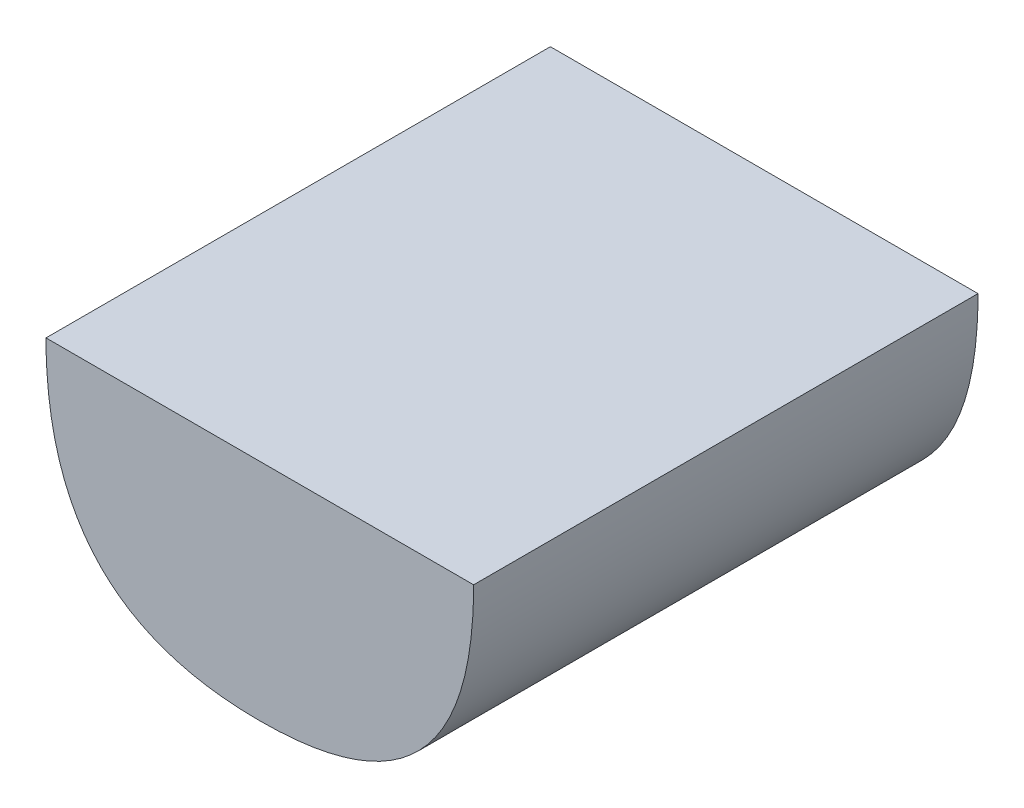
ISO-10303-21;
HEADER;
FILE_DESCRIPTION(('STEP AP214'),'2;1');
FILE_NAME('part.step','',(''),(''),'','','');
FILE_SCHEMA(('AUTOMOTIVE_DESIGN { 1 0 10303 214 1 1 1 1 }'));
ENDSEC;
DATA;
#1=APPLICATION_CONTEXT('core data for automotive mechanical design processes');
#2=APPLICATION_PROTOCOL_DEFINITION('international standard','automotive_design',2000,#1);
#3=PRODUCT_CONTEXT('',#1,'mechanical');
#4=PRODUCT('Part','Part','',(#3));
#5=PRODUCT_RELATED_PRODUCT_CATEGORY('part','',(#4));
#6=PRODUCT_DEFINITION_FORMATION('','',#4);
#7=PRODUCT_DEFINITION_CONTEXT('part definition',#1,'design');
#8=PRODUCT_DEFINITION('design','',#6,#7);
#9=PRODUCT_DEFINITION_SHAPE('','',#8);
#10=(LENGTH_UNIT() NAMED_UNIT(*) SI_UNIT(.MILLI.,.METRE.));
#11=(NAMED_UNIT(*) PLANE_ANGLE_UNIT() SI_UNIT($,.RADIAN.));
#12=(NAMED_UNIT(*) SI_UNIT($,.STERADIAN.) SOLID_ANGLE_UNIT());
#13=UNCERTAINTY_MEASURE_WITH_UNIT(LENGTH_MEASURE(1.E-05),#10,'distance_accuracy_value','');
#14=(GEOMETRIC_REPRESENTATION_CONTEXT(3) GLOBAL_UNCERTAINTY_ASSIGNED_CONTEXT((#13)) GLOBAL_UNIT_ASSIGNED_CONTEXT((#10,
#11,#12)) REPRESENTATION_CONTEXT('',''));
#15=CARTESIAN_POINT('',(0.,0.,0.));
#16=DIRECTION('',(0.,0.,1.));
#17=DIRECTION('',(1.,0.,0.));
#18=AXIS2_PLACEMENT_3D('',#15,#16,#17);
#19=CARTESIAN_POINT('',(0.,0.,356.616));
#20=CARTESIAN_POINT('',(-302.357037840975,-0.0664450020700911,356.616));
#21=CARTESIAN_POINT('',(-302.357037840975,317.813001305344,356.616));
#22=(BOUNDED_CURVE() B_SPLINE_CURVE(2,(#19,#20,#21),.UNSPECIFIED.,.F.,
.F.) B_SPLINE_CURVE_WITH_KNOTS((3,3),(0.,1.),
.UNSPECIFIED.) CURVE() GEOMETRIC_REPRESENTATION_ITEM() RATIONAL_B_SPLINE_CURVE((1.,
1.01936959538977,1.)) REPRESENTATION_ITEM(''));
#23=DIRECTION('',(0.,0.,-1.));
#24=VECTOR('',#23,1.);
#25=SURFACE_OF_LINEAR_EXTRUSION('',#22,#24);
#26=CARTESIAN_POINT('',(0.,0.,304.8));
#27=CARTESIAN_POINT('',(-302.357037840975,-0.0664450020700911,304.8));
#28=CARTESIAN_POINT('',(-302.357037840975,317.813001305344,304.8));
#29=(BOUNDED_CURVE() B_SPLINE_CURVE(2,(#26,#27,#28),.UNSPECIFIED.,.F.,
.F.) B_SPLINE_CURVE_WITH_KNOTS((3,3),(0.,1.),
.UNSPECIFIED.) CURVE() GEOMETRIC_REPRESENTATION_ITEM() RATIONAL_B_SPLINE_CURVE((1.,
1.01936959538977,1.)) REPRESENTATION_ITEM(''));
#30=CARTESIAN_POINT('',(-0.262571485168617,0.,304.8));
#31=VERTEX_POINT('',#30);
#32=CARTESIAN_POINT('',(-208.490476277115,60.9599999999999,304.8));
#33=VERTEX_POINT('',#32);
#34=EDGE_CURVE('E98',#31,#33,#29,.T.);
#35=ORIENTED_EDGE('',*,*,#34,.F.);
#36=CARTESIAN_POINT('',(0.,0.,304.8));
#37=CARTESIAN_POINT('',(-0.131315330519347,-2.8857431169774E-05,304.8));
#38=CARTESIAN_POINT('',(-0.262571485168617,0.,304.8));
#39=(BOUNDED_CURVE() B_SPLINE_CURVE(2,(#36,#37,#38),.UNSPECIFIED.,.F.,
.F.) B_SPLINE_CURVE_WITH_KNOTS((3,3),(0.,0.000426056560842924),
.UNSPECIFIED.) CURVE() GEOMETRIC_REPRESENTATION_ITEM() RATIONAL_B_SPLINE_CURVE((1.,
1.0000082525432,1.00001649805429)) REPRESENTATION_ITEM(''));
#40=CARTESIAN_POINT('',(0.,0.,304.8));
#41=VERTEX_POINT('',#40);
#42=EDGE_CURVE('E123',#31,#41,#39,.F.);
#43=ORIENTED_EDGE('',*,*,#42,.T.);
#44=DIRECTION('',(0.,0.,-1.));
#45=VECTOR('',#44,1.);
#46=CARTESIAN_POINT('',(0.,0.,356.616));
#47=LINE('',#46,#45);
#48=CARTESIAN_POINT('',(0.,0.,356.616));
#49=VERTEX_POINT('',#48);
#50=EDGE_CURVE('E119',#49,#41,#47,.T.);
#51=ORIENTED_EDGE('',*,*,#50,.F.);
#52=CARTESIAN_POINT('',(-302.357037840975,317.813001305344,356.616));
#53=VERTEX_POINT('',#52);
#54=EDGE_CURVE('E122',#49,#53,#22,.T.);
#55=ORIENTED_EDGE('',*,*,#54,.T.);
#56=DIRECTION('',(0.,0.,-1.));
#57=VECTOR('',#56,1.);
#58=CARTESIAN_POINT('',(-302.357037840975,317.813001305344,356.616));
#59=LINE('',#58,#57);
#60=CARTESIAN_POINT('',(-302.357037840975,317.813001305344,-356.616));
#61=VERTEX_POINT('',#60);
#62=EDGE_CURVE('E140',#53,#61,#59,.T.);
#63=ORIENTED_EDGE('',*,*,#62,.T.);
#64=CARTESIAN_POINT('',(0.,0.,-356.616));
#65=CARTESIAN_POINT('',(-302.357037840975,-0.0664450020700911,-356.616));
#66=CARTESIAN_POINT('',(-302.357037840975,317.813001305344,-356.616));
#67=(BOUNDED_CURVE() B_SPLINE_CURVE(2,(#64,#65,#66),.UNSPECIFIED.,.F.,
.F.) B_SPLINE_CURVE_WITH_KNOTS((3,3),(0.,1.),
.UNSPECIFIED.) CURVE() GEOMETRIC_REPRESENTATION_ITEM() RATIONAL_B_SPLINE_CURVE((1.,
1.01936959538977,1.)) REPRESENTATION_ITEM(''));
#68=CARTESIAN_POINT('',(0.,0.,-356.616));
#69=VERTEX_POINT('',#68);
#70=EDGE_CURVE('E136',#69,#61,#67,.T.);
#71=ORIENTED_EDGE('',*,*,#70,.F.);
#72=CARTESIAN_POINT('',(0.,0.,-304.8));
#73=VERTEX_POINT('',#72);
#74=EDGE_CURVE('E127',#73,#69,#47,.T.);
#75=ORIENTED_EDGE('',*,*,#74,.F.);
#76=CARTESIAN_POINT('',(0.,0.,-304.8));
#77=CARTESIAN_POINT('',(-0.131315330519347,-2.8857431169774E-05,-304.8));
#78=CARTESIAN_POINT('',(-0.262571485168617,0.,-304.8));
#79=(BOUNDED_CURVE() B_SPLINE_CURVE(2,(#76,#77,#78),.UNSPECIFIED.,.F.,
.F.) B_SPLINE_CURVE_WITH_KNOTS((3,3),(0.,0.000426056560842924),
.UNSPECIFIED.) CURVE() GEOMETRIC_REPRESENTATION_ITEM() RATIONAL_B_SPLINE_CURVE((1.,
1.0000082525432,1.00001649805429)) REPRESENTATION_ITEM(''));
#80=CARTESIAN_POINT('',(-0.262571485168617,0.,-304.8));
#81=VERTEX_POINT('',#80);
#82=EDGE_CURVE('E233',#81,#73,#79,.F.);
#83=ORIENTED_EDGE('',*,*,#82,.F.);
#84=CARTESIAN_POINT('',(0.,0.,-304.8));
#85=CARTESIAN_POINT('',(-302.357037840975,-0.0664450020700911,-304.8));
#86=CARTESIAN_POINT('',(-302.357037840975,317.813001305344,-304.8));
#87=(BOUNDED_CURVE() B_SPLINE_CURVE(2,(#84,#85,#86),.UNSPECIFIED.,.F.,
.F.) B_SPLINE_CURVE_WITH_KNOTS((3,3),(0.,1.),
.UNSPECIFIED.) CURVE() GEOMETRIC_REPRESENTATION_ITEM() RATIONAL_B_SPLINE_CURVE((1.,
1.01936959538977,1.)) REPRESENTATION_ITEM(''));
#88=CARTESIAN_POINT('',(-208.490476277115,60.9599999999999,-304.8));
#89=VERTEX_POINT('',#88);
#90=EDGE_CURVE('E144',#81,#89,#87,.T.);
#91=ORIENTED_EDGE('',*,*,#90,.T.);
#92=DIRECTION('',(0.,0.,-1.));
#93=VECTOR('',#92,1.);
#94=CARTESIAN_POINT('',(-208.490476277116,60.9599999999979,356.616));
#95=LINE('',#94,#93);
#96=EDGE_CURVE('E65',#89,#33,#95,.F.);
#97=ORIENTED_EDGE('',*,*,#96,.T.);
#98=EDGE_LOOP('',(#35,#43,#51,#55,#63,#71,#75,#83,#91,#97));
#99=FACE_BOUND('',#98,.T.);
#100=ADVANCED_FACE('F43',(#99),#25,.T.);
#101=CARTESIAN_POINT('',(0.,0.,356.616));
#102=CARTESIAN_POINT('',(302.357037840975,-0.0664450020701375,356.616));
#103=CARTESIAN_POINT('',(302.357037840975,317.813001305344,356.616));
#104=(BOUNDED_CURVE() B_SPLINE_CURVE(2,(#101,#102,#103),.UNSPECIFIED.,.F.,
.F.) B_SPLINE_CURVE_WITH_KNOTS((3,3),(0.,1.),
.UNSPECIFIED.) CURVE() GEOMETRIC_REPRESENTATION_ITEM() RATIONAL_B_SPLINE_CURVE((1.,
1.01936959538977,1.)) REPRESENTATION_ITEM(''));
#105=DIRECTION('',(0.,0.,-1.));
#106=VECTOR('',#105,1.);
#107=SURFACE_OF_LINEAR_EXTRUSION('',#104,#106);
#108=ORIENTED_EDGE('',*,*,#50,.T.);
#109=CARTESIAN_POINT('',(0.,0.,304.8));
#110=CARTESIAN_POINT('',(0.131315330519791,-2.88574311698918E-05,304.8));
#111=CARTESIAN_POINT('',(0.262571485169505,0.,304.8));
#112=(BOUNDED_CURVE() B_SPLINE_CURVE(2,(#109,#110,#111),.UNSPECIFIED.,.F.,
.F.) B_SPLINE_CURVE_WITH_KNOTS((3,3),(0.,0.000426056560844365),
.UNSPECIFIED.) CURVE() GEOMETRIC_REPRESENTATION_ITEM() RATIONAL_B_SPLINE_CURVE((1.,
1.0000082525432,1.00001649805429)) REPRESENTATION_ITEM(''));
#113=CARTESIAN_POINT('',(0.262571485169286,0.,304.8));
#114=VERTEX_POINT('',#113);
#115=EDGE_CURVE('E48',#41,#114,#112,.T.);
#116=ORIENTED_EDGE('',*,*,#115,.T.);
#117=CARTESIAN_POINT('',(0.,0.,304.8));
#118=CARTESIAN_POINT('',(302.357037840975,-0.0664450020701375,304.8));
#119=CARTESIAN_POINT('',(302.357037840975,317.813001305344,304.8));
#120=(BOUNDED_CURVE() B_SPLINE_CURVE(2,(#117,#118,#119),.UNSPECIFIED.,.F.,
.F.) B_SPLINE_CURVE_WITH_KNOTS((3,3),(0.,1.),
.UNSPECIFIED.) CURVE() GEOMETRIC_REPRESENTATION_ITEM() RATIONAL_B_SPLINE_CURVE((1.,
1.01936959538977,1.)) REPRESENTATION_ITEM(''));
#121=CARTESIAN_POINT('',(208.490476277116,60.9599999999999,304.8));
#122=VERTEX_POINT('',#121);
#123=EDGE_CURVE('E94',#114,#122,#120,.T.);
#124=ORIENTED_EDGE('',*,*,#123,.T.);
#125=DIRECTION('',(0.,0.,-1.));
#126=VECTOR('',#125,1.);
#127=CARTESIAN_POINT('',(208.490476277116,60.9599999999979,356.616));
#128=LINE('',#127,#126);
#129=CARTESIAN_POINT('',(208.490476277116,60.9599999999999,-304.8));
#130=VERTEX_POINT('',#129);
#131=EDGE_CURVE('E57',#130,#122,#128,.F.);
#132=ORIENTED_EDGE('',*,*,#131,.F.);
#133=CARTESIAN_POINT('',(0.,0.,-304.8));
#134=CARTESIAN_POINT('',(302.357037840975,-0.0664450020701375,-304.8));
#135=CARTESIAN_POINT('',(302.357037840975,317.813001305344,-304.8));
#136=(BOUNDED_CURVE() B_SPLINE_CURVE(2,(#133,#134,#135),.UNSPECIFIED.,.F.,
.F.) B_SPLINE_CURVE_WITH_KNOTS((3,3),(0.,1.),
.UNSPECIFIED.) CURVE() GEOMETRIC_REPRESENTATION_ITEM() RATIONAL_B_SPLINE_CURVE((1.,
1.01936959538977,1.)) REPRESENTATION_ITEM(''));
#137=CARTESIAN_POINT('',(0.262571485169287,0.,-304.8));
#138=VERTEX_POINT('',#137);
#139=EDGE_CURVE('E214',#138,#130,#136,.T.);
#140=ORIENTED_EDGE('',*,*,#139,.F.);
#141=CARTESIAN_POINT('',(0.,0.,-304.8));
#142=CARTESIAN_POINT('',(0.131315330519682,-2.88574311698678E-05,-304.8));
#143=CARTESIAN_POINT('',(0.262571485169287,0.,-304.8));
#144=(BOUNDED_CURVE() B_SPLINE_CURVE(2,(#141,#142,#143),.UNSPECIFIED.,.F.,
.F.) B_SPLINE_CURVE_WITH_KNOTS((3,3),(0.,0.000426056560844011),
.UNSPECIFIED.) CURVE() GEOMETRIC_REPRESENTATION_ITEM() RATIONAL_B_SPLINE_CURVE((1.,
1.0000082525432,1.00001649805429)) REPRESENTATION_ITEM(''));
#145=EDGE_CURVE('E223',#73,#138,#144,.T.);
#146=ORIENTED_EDGE('',*,*,#145,.F.);
#147=ORIENTED_EDGE('',*,*,#74,.T.);
#148=CARTESIAN_POINT('',(0.,0.,-356.616));
#149=CARTESIAN_POINT('',(302.357037840975,-0.0664450020701375,-356.616));
#150=CARTESIAN_POINT('',(302.357037840975,317.813001305344,-356.616));
#151=(BOUNDED_CURVE() B_SPLINE_CURVE(2,(#148,#149,#150),.UNSPECIFIED.,.F.,
.F.) B_SPLINE_CURVE_WITH_KNOTS((3,3),(0.,1.),
.UNSPECIFIED.) CURVE() GEOMETRIC_REPRESENTATION_ITEM() RATIONAL_B_SPLINE_CURVE((1.,
1.01936959538977,1.)) REPRESENTATION_ITEM(''));
#152=CARTESIAN_POINT('',(302.357037840975,317.813001305344,-356.616));
#153=VERTEX_POINT('',#152);
#154=EDGE_CURVE('E185',#69,#153,#151,.T.);
#155=ORIENTED_EDGE('',*,*,#154,.T.);
#156=DIRECTION('',(0.,0.,-1.));
#157=VECTOR('',#156,1.);
#158=CARTESIAN_POINT('',(302.357037840975,317.813001305344,356.616));
#159=LINE('',#158,#157);
#160=CARTESIAN_POINT('',(302.357037840975,317.813001305344,356.616));
#161=VERTEX_POINT('',#160);
#162=EDGE_CURVE('E131',#161,#153,#159,.T.);
#163=ORIENTED_EDGE('',*,*,#162,.F.);
#164=EDGE_CURVE('E129',#49,#161,#104,.T.);
#165=ORIENTED_EDGE('',*,*,#164,.F.);
#166=EDGE_LOOP('',(#108,#116,#124,#132,#140,#146,#147,#155,#163,#165));
#167=FACE_BOUND('',#166,.T.);
#168=ADVANCED_FACE('F45',(#167),#107,.F.);
#169=CARTESIAN_POINT('',(-302.357037840975,317.813001305344,356.616));
#170=DIRECTION('',(0.,1.,0.));
#171=DIRECTION('',(-1.,0.,0.));
#172=AXIS2_PLACEMENT_3D('',#169,#170,#171);
#173=PLANE('',#172);
#174=ORIENTED_EDGE('',*,*,#162,.T.);
#175=DIRECTION('',(1.,0.,0.));
#176=VECTOR('',#175,1.);
#177=CARTESIAN_POINT('',(-302.357037840975,317.813001305344,-356.616));
#178=LINE('',#177,#176);
#179=EDGE_CURVE('E182',#61,#153,#178,.T.);
#180=ORIENTED_EDGE('',*,*,#179,.F.);
#181=ORIENTED_EDGE('',*,*,#62,.F.);
#182=DIRECTION('',(1.,0.,0.));
#183=VECTOR('',#182,1.);
#184=CARTESIAN_POINT('',(-302.357037840975,317.813001305344,356.616));
#185=LINE('',#184,#183);
#186=EDGE_CURVE('E137',#53,#161,#185,.T.);
#187=ORIENTED_EDGE('',*,*,#186,.T.);
#188=EDGE_LOOP('',(#174,#180,#181,#187));
#189=FACE_BOUND('',#188,.T.);
#190=ADVANCED_FACE('F174',(#189),#173,.T.);
#191=CARTESIAN_POINT('',(-227.492823154556,78.6576013625369,356.616));
#192=DIRECTION('',(0.,0.,1.));
#193=DIRECTION('',(1.,0.,0.));
#194=AXIS2_PLACEMENT_3D('',#191,#192,#193);
#195=PLANE('',#194);
#196=ORIENTED_EDGE('',*,*,#54,.F.);
#197=ORIENTED_EDGE('',*,*,#164,.T.);
#198=ORIENTED_EDGE('',*,*,#186,.F.);
#199=EDGE_LOOP('',(#196,#197,#198));
#200=FACE_BOUND('',#199,.T.);
#201=ADVANCED_FACE('F138',(#200),#195,.T.);
#202=CARTESIAN_POINT('',(-227.492823154556,78.6576013625369,-356.616));
#203=DIRECTION('',(0.,0.,1.));
#204=DIRECTION('',(1.,0.,0.));
#205=AXIS2_PLACEMENT_3D('',#202,#203,#204);
#206=PLANE('',#205);
#207=ORIENTED_EDGE('',*,*,#70,.T.);
#208=ORIENTED_EDGE('',*,*,#179,.T.);
#209=ORIENTED_EDGE('',*,*,#154,.F.);
#210=EDGE_LOOP('',(#207,#208,#209));
#211=FACE_BOUND('',#210,.T.);
#212=ADVANCED_FACE('F162',(#211),#206,.F.);
#213=CARTESIAN_POINT('',(0.,0.,304.8));
#214=DIRECTION('',(0.,0.,1.));
#215=DIRECTION('',(1.,0.,0.));
#216=AXIS2_PLACEMENT_3D('',#213,#214,#215);
#217=PLANE('',#216);
#218=ORIENTED_EDGE('',*,*,#34,.T.);
#219=DIRECTION('',(-1.,0.,0.));
#220=VECTOR('',#219,1.);
#221=CARTESIAN_POINT('',(302.357037840975,60.96,304.8));
#222=LINE('',#221,#220);
#223=EDGE_CURVE('E11',#122,#33,#222,.T.);
#224=ORIENTED_EDGE('',*,*,#223,.F.);
#225=ORIENTED_EDGE('',*,*,#123,.F.);
#226=ORIENTED_EDGE('',*,*,#115,.F.);
#227=ORIENTED_EDGE('',*,*,#42,.F.);
#228=EDGE_LOOP('',(#218,#224,#225,#226,#227));
#229=FACE_BOUND('',#228,.T.);
#230=ADVANCED_FACE('F158',(#229),#217,.F.);
#231=CARTESIAN_POINT('',(0.,0.,-304.8));
#232=DIRECTION('',(0.,0.,1.));
#233=DIRECTION('',(1.,0.,0.));
#234=AXIS2_PLACEMENT_3D('',#231,#232,#233);
#235=PLANE('',#234);
#236=ORIENTED_EDGE('',*,*,#82,.T.);
#237=ORIENTED_EDGE('',*,*,#145,.T.);
#238=ORIENTED_EDGE('',*,*,#139,.T.);
#239=DIRECTION('',(-1.,0.,0.));
#240=VECTOR('',#239,1.);
#241=CARTESIAN_POINT('',(302.357037840975,60.96,-304.8));
#242=LINE('',#241,#240);
#243=EDGE_CURVE('E222',#130,#89,#242,.T.);
#244=ORIENTED_EDGE('',*,*,#243,.T.);
#245=ORIENTED_EDGE('',*,*,#90,.F.);
#246=EDGE_LOOP('',(#236,#237,#238,#244,#245));
#247=FACE_BOUND('',#246,.T.);
#248=ADVANCED_FACE('F161',(#247),#235,.T.);
#249=CARTESIAN_POINT('',(302.357037840975,60.96,304.8));
#250=DIRECTION('',(0.,-1.,0.));
#251=DIRECTION('',(1.,0.,0.));
#252=AXIS2_PLACEMENT_3D('',#249,#250,#251);
#253=PLANE('',#252);
#254=ORIENTED_EDGE('',*,*,#243,.F.);
#255=ORIENTED_EDGE('',*,*,#131,.T.);
#256=ORIENTED_EDGE('',*,*,#223,.T.);
#257=ORIENTED_EDGE('',*,*,#96,.F.);
#258=EDGE_LOOP('',(#254,#255,#256,#257));
#259=FACE_BOUND('',#258,.T.);
#260=ADVANCED_FACE('F165',(#259),#253,.T.);
#261=CLOSED_SHELL('',(#100,#168,#190,#201,#212,#230,#248,#260));
#262=MANIFOLD_SOLID_BREP('B2',#261);
#263=ADVANCED_BREP_SHAPE_REPRESENTATION('',(#18,#262),#14);
#264=SHAPE_DEFINITION_REPRESENTATION(#9,#263);
ENDSEC;
END-ISO-10303-21;
